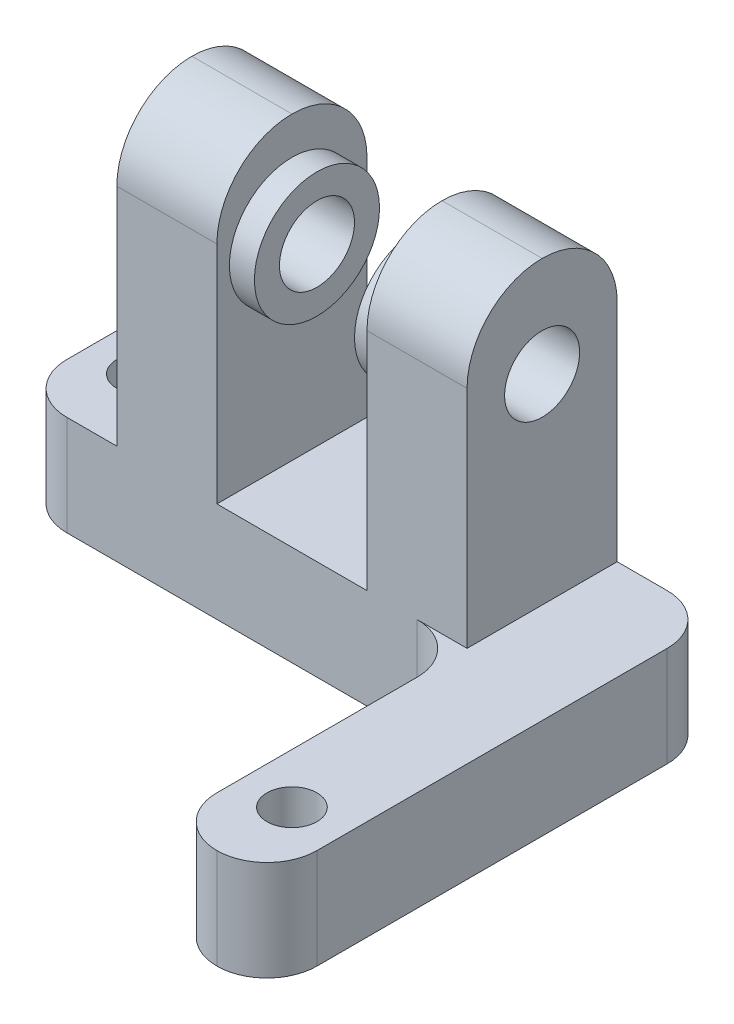
ISO-10303-21;
HEADER;
FILE_DESCRIPTION(('STEP AP214'),'2;1');
FILE_NAME('part.step','',(''),(''),'','','');
FILE_SCHEMA(('AUTOMOTIVE_DESIGN { 1 0 10303 214 1 1 1 1 }'));
ENDSEC;
DATA;
#1=APPLICATION_CONTEXT('core data for automotive mechanical design processes');
#2=APPLICATION_PROTOCOL_DEFINITION('international standard','automotive_design',2000,#1);
#3=PRODUCT_CONTEXT('',#1,'mechanical');
#4=PRODUCT('Part','Part','',(#3));
#5=PRODUCT_RELATED_PRODUCT_CATEGORY('part','',(#4));
#6=PRODUCT_DEFINITION_FORMATION('','',#4);
#7=PRODUCT_DEFINITION_CONTEXT('part definition',#1,'design');
#8=PRODUCT_DEFINITION('design','',#6,#7);
#9=PRODUCT_DEFINITION_SHAPE('','',#8);
#10=(LENGTH_UNIT() NAMED_UNIT(*) SI_UNIT(.MILLI.,.METRE.));
#11=(NAMED_UNIT(*) PLANE_ANGLE_UNIT() SI_UNIT($,.RADIAN.));
#12=(NAMED_UNIT(*) SI_UNIT($,.STERADIAN.) SOLID_ANGLE_UNIT());
#13=UNCERTAINTY_MEASURE_WITH_UNIT(LENGTH_MEASURE(1.E-05),#10,'distance_accuracy_value','');
#14=(GEOMETRIC_REPRESENTATION_CONTEXT(3) GLOBAL_UNCERTAINTY_ASSIGNED_CONTEXT((#13)) GLOBAL_UNIT_ASSIGNED_CONTEXT((#10,
#11,#12)) REPRESENTATION_CONTEXT('',''));
#15=CARTESIAN_POINT('',(0.,0.,0.));
#16=DIRECTION('',(0.,0.,1.));
#17=DIRECTION('',(1.,0.,0.));
#18=AXIS2_PLACEMENT_3D('',#15,#16,#17);
#19=CARTESIAN_POINT('',(-7.,4.,-3.));
#20=DIRECTION('',(1.,0.,0.));
#21=DIRECTION('',(0.,0.,-1.));
#22=AXIS2_PLACEMENT_3D('',#19,#20,#21);
#23=PLANE('',#22);
#24=CARTESIAN_POINT('',(-7.,12.,0.));
#25=DIRECTION('',(1.,0.,0.));
#26=DIRECTION('',(0.,0.,-1.));
#27=AXIS2_PLACEMENT_3D('',#24,#25,#26);
#28=CIRCLE('',#27,1.5);
#29=CARTESIAN_POINT('',(-7.,12.,-1.5));
#30=VERTEX_POINT('',#29);
#31=EDGE_CURVE('E254',#30,#30,#28,.T.);
#32=ORIENTED_EDGE('',*,*,#31,.T.);
#33=EDGE_LOOP('',(#32));
#34=FACE_BOUND('',#33,.T.);
#35=CARTESIAN_POINT('',(-7.,13.,0.));
#36=DIRECTION('',(1.,0.,0.));
#37=DIRECTION('',(0.,0.,-1.));
#38=AXIS2_PLACEMENT_3D('',#35,#36,#37);
#39=CIRCLE('',#38,3.);
#40=CARTESIAN_POINT('',(-7.,13.,3.));
#41=VERTEX_POINT('',#40);
#42=CARTESIAN_POINT('',(-7.,16.,0.));
#43=VERTEX_POINT('',#42);
#44=EDGE_CURVE('E346',#41,#43,#39,.F.);
#45=ORIENTED_EDGE('',*,*,#44,.T.);
#46=CARTESIAN_POINT('',(-7.,13.,0.));
#47=DIRECTION('',(1.,0.,0.));
#48=DIRECTION('',(0.,0.,-1.));
#49=AXIS2_PLACEMENT_3D('',#46,#47,#48);
#50=CIRCLE('',#49,3.);
#51=CARTESIAN_POINT('',(-7.,13.,-3.));
#52=VERTEX_POINT('',#51);
#53=EDGE_CURVE('E184',#43,#52,#50,.F.);
#54=ORIENTED_EDGE('',*,*,#53,.T.);
#55=DIRECTION('',(0.,-1.,0.));
#56=VECTOR('',#55,1.);
#57=CARTESIAN_POINT('',(-7.,4.,-3.));
#58=LINE('',#57,#56);
#59=CARTESIAN_POINT('',(-7.,4.,-3.));
#60=VERTEX_POINT('',#59);
#61=EDGE_CURVE('E178',#52,#60,#58,.T.);
#62=ORIENTED_EDGE('',*,*,#61,.T.);
#63=DIRECTION('',(0.,0.,-1.));
#64=VECTOR('',#63,1.);
#65=CARTESIAN_POINT('',(-7.,4.,3.));
#66=LINE('',#65,#64);
#67=CARTESIAN_POINT('',(-7.,4.,3.));
#68=VERTEX_POINT('',#67);
#69=EDGE_CURVE('E182',#68,#60,#66,.T.);
#70=ORIENTED_EDGE('',*,*,#69,.F.);
#71=DIRECTION('',(0.,-1.,0.));
#72=VECTOR('',#71,1.);
#73=CARTESIAN_POINT('',(-7.,4.,3.));
#74=LINE('',#73,#72);
#75=EDGE_CURVE('E189',#41,#68,#74,.T.);
#76=ORIENTED_EDGE('',*,*,#75,.F.);
#77=EDGE_LOOP('',(#45,#54,#62,#70,#76));
#78=FACE_BOUND('',#77,.T.);
#79=ADVANCED_FACE('F36',(#34,#78),#23,.F.);
#80=CARTESIAN_POINT('',(7.,4.,-3.));
#81=DIRECTION('',(-1.,0.,0.));
#82=DIRECTION('',(0.,0.,1.));
#83=AXIS2_PLACEMENT_3D('',#80,#81,#82);
#84=PLANE('',#83);
#85=CARTESIAN_POINT('',(7.,12.,0.));
#86=DIRECTION('',(-1.,0.,0.));
#87=DIRECTION('',(0.,0.,1.));
#88=AXIS2_PLACEMENT_3D('',#85,#86,#87);
#89=CIRCLE('',#88,1.5);
#90=CARTESIAN_POINT('',(7.,12.,1.5));
#91=VERTEX_POINT('',#90);
#92=EDGE_CURVE('E257',#91,#91,#89,.T.);
#93=ORIENTED_EDGE('',*,*,#92,.T.);
#94=EDGE_LOOP('',(#93));
#95=FACE_BOUND('',#94,.T.);
#96=DIRECTION('',(0.,-1.,0.));
#97=VECTOR('',#96,1.);
#98=CARTESIAN_POINT('',(7.,4.,-3.));
#99=LINE('',#98,#97);
#100=CARTESIAN_POINT('',(7.,13.,-3.));
#101=VERTEX_POINT('',#100);
#102=CARTESIAN_POINT('',(7.,4.,-3.));
#103=VERTEX_POINT('',#102);
#104=EDGE_CURVE('E188',#101,#103,#99,.T.);
#105=ORIENTED_EDGE('',*,*,#104,.F.);
#106=CARTESIAN_POINT('',(7.,13.,0.));
#107=DIRECTION('',(-1.,0.,0.));
#108=DIRECTION('',(0.,0.,1.));
#109=AXIS2_PLACEMENT_3D('',#106,#107,#108);
#110=CIRCLE('',#109,3.);
#111=CARTESIAN_POINT('',(7.,16.,0.));
#112=VERTEX_POINT('',#111);
#113=EDGE_CURVE('E58',#101,#112,#110,.F.);
#114=ORIENTED_EDGE('',*,*,#113,.T.);
#115=CARTESIAN_POINT('',(7.,13.,0.));
#116=DIRECTION('',(-1.,0.,0.));
#117=DIRECTION('',(0.,0.,1.));
#118=AXIS2_PLACEMENT_3D('',#115,#116,#117);
#119=CIRCLE('',#118,3.);
#120=CARTESIAN_POINT('',(7.,13.,3.));
#121=VERTEX_POINT('',#120);
#122=EDGE_CURVE('E53',#112,#121,#119,.F.);
#123=ORIENTED_EDGE('',*,*,#122,.T.);
#124=DIRECTION('',(0.,-1.,0.));
#125=VECTOR('',#124,1.);
#126=CARTESIAN_POINT('',(7.,4.,3.));
#127=LINE('',#126,#125);
#128=CARTESIAN_POINT('',(7.,4.,3.));
#129=VERTEX_POINT('',#128);
#130=EDGE_CURVE('E282',#121,#129,#127,.T.);
#131=ORIENTED_EDGE('',*,*,#130,.T.);
#132=DIRECTION('',(0.,0.,1.));
#133=VECTOR('',#132,1.);
#134=CARTESIAN_POINT('',(7.,4.,-3.));
#135=LINE('',#134,#133);
#136=EDGE_CURVE('E231',#103,#129,#135,.T.);
#137=ORIENTED_EDGE('',*,*,#136,.F.);
#138=EDGE_LOOP('',(#105,#114,#123,#131,#137));
#139=FACE_BOUND('',#138,.T.);
#140=ADVANCED_FACE('F453',(#95,#139),#84,.F.);
#141=CARTESIAN_POINT('',(3.,16.,3.));
#142=DIRECTION('',(1.,0.,0.));
#143=DIRECTION('',(0.,0.,-1.));
#144=AXIS2_PLACEMENT_3D('',#141,#142,#143);
#145=PLANE('',#144);
#146=CARTESIAN_POINT('',(3.,13.,0.));
#147=DIRECTION('',(1.,0.,0.));
#148=DIRECTION('',(0.,0.,-1.));
#149=AXIS2_PLACEMENT_3D('',#146,#147,#148);
#150=CIRCLE('',#149,3.);
#151=CARTESIAN_POINT('',(3.,13.,3.));
#152=VERTEX_POINT('',#151);
#153=CARTESIAN_POINT('',(3.,16.,0.));
#154=VERTEX_POINT('',#153);
#155=EDGE_CURVE('E361',#152,#154,#150,.F.);
#156=ORIENTED_EDGE('',*,*,#155,.T.);
#157=CARTESIAN_POINT('',(3.,13.,0.));
#158=DIRECTION('',(1.,0.,0.));
#159=DIRECTION('',(0.,0.,-1.));
#160=AXIS2_PLACEMENT_3D('',#157,#158,#159);
#161=CIRCLE('',#160,3.);
#162=CARTESIAN_POINT('',(3.,13.,-3.));
#163=VERTEX_POINT('',#162);
#164=EDGE_CURVE('E363',#154,#163,#161,.F.);
#165=ORIENTED_EDGE('',*,*,#164,.T.);
#166=DIRECTION('',(0.,-1.,0.));
#167=VECTOR('',#166,1.);
#168=CARTESIAN_POINT('',(3.,16.,-3.));
#169=LINE('',#168,#167);
#170=CARTESIAN_POINT('',(3.,4.,-3.));
#171=VERTEX_POINT('',#170);
#172=EDGE_CURVE('E260',#163,#171,#169,.T.);
#173=ORIENTED_EDGE('',*,*,#172,.T.);
#174=DIRECTION('',(0.,0.,1.));
#175=VECTOR('',#174,1.);
#176=CARTESIAN_POINT('',(3.,4.,3.));
#177=LINE('',#176,#175);
#178=CARTESIAN_POINT('',(3.,4.,3.));
#179=VERTEX_POINT('',#178);
#180=EDGE_CURVE('E264',#171,#179,#177,.T.);
#181=ORIENTED_EDGE('',*,*,#180,.T.);
#182=DIRECTION('',(0.,-1.,0.));
#183=VECTOR('',#182,1.);
#184=CARTESIAN_POINT('',(3.,16.,3.));
#185=LINE('',#184,#183);
#186=EDGE_CURVE('E262',#152,#179,#185,.T.);
#187=ORIENTED_EDGE('',*,*,#186,.F.);
#188=EDGE_LOOP('',(#156,#165,#173,#181,#187));
#189=FACE_BOUND('',#188,.T.);
#190=CARTESIAN_POINT('',(3.,12.,0.));
#191=DIRECTION('',(1.,0.,0.));
#192=DIRECTION('',(0.,0.,-1.));
#193=AXIS2_PLACEMENT_3D('',#190,#191,#192);
#194=CIRCLE('',#193,2.5);
#195=CARTESIAN_POINT('',(3.,12.,-2.5));
#196=VERTEX_POINT('',#195);
#197=EDGE_CURVE('E292',#196,#196,#194,.F.);
#198=ORIENTED_EDGE('',*,*,#197,.F.);
#199=EDGE_LOOP('',(#198));
#200=FACE_BOUND('',#199,.T.);
#201=ADVANCED_FACE('F384',(#189,#200),#145,.F.);
#202=CARTESIAN_POINT('',(-3.,16.,3.));
#203=DIRECTION('',(-1.,0.,0.));
#204=DIRECTION('',(0.,0.,1.));
#205=AXIS2_PLACEMENT_3D('',#202,#203,#204);
#206=PLANE('',#205);
#207=DIRECTION('',(0.,-1.,0.));
#208=VECTOR('',#207,1.);
#209=CARTESIAN_POINT('',(-3.,16.,-3.));
#210=LINE('',#209,#208);
#211=CARTESIAN_POINT('',(-3.,13.,-3.));
#212=VERTEX_POINT('',#211);
#213=CARTESIAN_POINT('',(-3.,4.,-3.));
#214=VERTEX_POINT('',#213);
#215=EDGE_CURVE('E270',#212,#214,#210,.T.);
#216=ORIENTED_EDGE('',*,*,#215,.F.);
#217=CARTESIAN_POINT('',(-3.,13.,0.));
#218=DIRECTION('',(-1.,0.,0.));
#219=DIRECTION('',(0.,0.,1.));
#220=AXIS2_PLACEMENT_3D('',#217,#218,#219);
#221=CIRCLE('',#220,3.);
#222=CARTESIAN_POINT('',(-3.,16.,0.));
#223=VERTEX_POINT('',#222);
#224=EDGE_CURVE('E359',#212,#223,#221,.F.);
#225=ORIENTED_EDGE('',*,*,#224,.T.);
#226=CARTESIAN_POINT('',(-3.,13.,0.));
#227=DIRECTION('',(-1.,0.,0.));
#228=DIRECTION('',(0.,0.,1.));
#229=AXIS2_PLACEMENT_3D('',#226,#227,#228);
#230=CIRCLE('',#229,3.);
#231=CARTESIAN_POINT('',(-3.,13.,3.));
#232=VERTEX_POINT('',#231);
#233=EDGE_CURVE('E357',#223,#232,#230,.F.);
#234=ORIENTED_EDGE('',*,*,#233,.T.);
#235=DIRECTION('',(0.,-1.,0.));
#236=VECTOR('',#235,1.);
#237=CARTESIAN_POINT('',(-3.,16.,3.));
#238=LINE('',#237,#236);
#239=CARTESIAN_POINT('',(-3.,4.,3.));
#240=VERTEX_POINT('',#239);
#241=EDGE_CURVE('E272',#232,#240,#238,.T.);
#242=ORIENTED_EDGE('',*,*,#241,.T.);
#243=DIRECTION('',(0.,0.,-1.));
#244=VECTOR('',#243,1.);
#245=CARTESIAN_POINT('',(-3.,4.,3.));
#246=LINE('',#245,#244);
#247=EDGE_CURVE('E267',#240,#214,#246,.T.);
#248=ORIENTED_EDGE('',*,*,#247,.T.);
#249=EDGE_LOOP('',(#216,#225,#234,#242,#248));
#250=FACE_BOUND('',#249,.T.);
#251=CARTESIAN_POINT('',(-3.,12.,0.));
#252=DIRECTION('',(-1.,0.,0.));
#253=DIRECTION('',(0.,0.,1.));
#254=AXIS2_PLACEMENT_3D('',#251,#252,#253);
#255=CIRCLE('',#254,2.5);
#256=CARTESIAN_POINT('',(-3.,12.,2.5));
#257=VERTEX_POINT('',#256);
#258=EDGE_CURVE('E289',#257,#257,#255,.F.);
#259=ORIENTED_EDGE('',*,*,#258,.F.);
#260=EDGE_LOOP('',(#259));
#261=FACE_BOUND('',#260,.T.);
#262=ADVANCED_FACE('F394',(#250,#261),#206,.F.);
#263=CARTESIAN_POINT('',(0.,4.,0.));
#264=DIRECTION('',(0.,1.,0.));
#265=DIRECTION('',(0.,0.,1.));
#266=AXIS2_PLACEMENT_3D('',#263,#264,#265);
#267=PLANE('',#266);
#268=DIRECTION('',(1.,0.,0.));
#269=VECTOR('',#268,1.);
#270=CARTESIAN_POINT('',(-7.,4.,3.));
#271=LINE('',#270,#269);
#272=EDGE_CURVE('E278',#240,#179,#271,.T.);
#273=ORIENTED_EDGE('',*,*,#272,.T.);
#274=ORIENTED_EDGE('',*,*,#180,.F.);
#275=DIRECTION('',(-1.,0.,0.));
#276=VECTOR('',#275,1.);
#277=CARTESIAN_POINT('',(-7.,4.,-3.));
#278=LINE('',#277,#276);
#279=EDGE_CURVE('E275',#171,#214,#278,.T.);
#280=ORIENTED_EDGE('',*,*,#279,.T.);
#281=ORIENTED_EDGE('',*,*,#247,.F.);
#282=EDGE_LOOP('',(#273,#274,#280,#281));
#283=FACE_BOUND('',#282,.T.);
#284=ADVANCED_FACE('F390',(#283),#267,.T.);
#285=CARTESIAN_POINT('',(-7.,4.,-3.));
#286=DIRECTION('',(0.,0.,1.));
#287=DIRECTION('',(1.,0.,0.));
#288=AXIS2_PLACEMENT_3D('',#285,#286,#287);
#289=PLANE('',#288);
#290=ORIENTED_EDGE('',*,*,#61,.F.);
#291=DIRECTION('',(-1.,0.,0.));
#292=VECTOR('',#291,1.);
#293=CARTESIAN_POINT('',(-3.,13.,-3.));
#294=LINE('',#293,#292);
#295=EDGE_CURVE('E355',#52,#212,#294,.F.);
#296=ORIENTED_EDGE('',*,*,#295,.T.);
#297=ORIENTED_EDGE('',*,*,#215,.T.);
#298=ORIENTED_EDGE('',*,*,#279,.F.);
#299=ORIENTED_EDGE('',*,*,#172,.F.);
#300=DIRECTION('',(-1.,0.,0.));
#301=VECTOR('',#300,1.);
#302=CARTESIAN_POINT('',(-7.,13.,-3.));
#303=LINE('',#302,#301);
#304=EDGE_CURVE('E352',#163,#101,#303,.F.);
#305=ORIENTED_EDGE('',*,*,#304,.T.);
#306=ORIENTED_EDGE('',*,*,#104,.T.);
#307=DIRECTION('',(-1.,0.,0.));
#308=VECTOR('',#307,1.);
#309=CARTESIAN_POINT('',(11.,4.,-3.));
#310=LINE('',#309,#308);
#311=CARTESIAN_POINT('',(9.,4.,-3.));
#312=VERTEX_POINT('',#311);
#313=EDGE_CURVE('E237',#312,#103,#310,.T.);
#314=ORIENTED_EDGE('',*,*,#313,.F.);
#315=DIRECTION('',(0.,1.,0.));
#316=VECTOR('',#315,1.);
#317=CARTESIAN_POINT('',(9.,0.,-3.));
#318=LINE('',#317,#316);
#319=CARTESIAN_POINT('',(8.99999999999999,0.,-3.));
#320=VERTEX_POINT('',#319);
#321=EDGE_CURVE('E340',#312,#320,#318,.F.);
#322=ORIENTED_EDGE('',*,*,#321,.T.);
#323=DIRECTION('',(-1.,0.,0.));
#324=VECTOR('',#323,1.);
#325=CARTESIAN_POINT('',(-7.,0.,-3.));
#326=LINE('',#325,#324);
#327=CARTESIAN_POINT('',(-9.,0.,-3.));
#328=VERTEX_POINT('',#327);
#329=EDGE_CURVE('E274',#320,#328,#326,.T.);
#330=ORIENTED_EDGE('',*,*,#329,.T.);
#331=DIRECTION('',(0.,1.,0.));
#332=VECTOR('',#331,1.);
#333=CARTESIAN_POINT('',(-9.,4.,-3.));
#334=LINE('',#333,#332);
#335=CARTESIAN_POINT('',(-9.,4.,-3.));
#336=VERTEX_POINT('',#335);
#337=EDGE_CURVE('E197',#328,#336,#334,.T.);
#338=ORIENTED_EDGE('',*,*,#337,.T.);
#339=DIRECTION('',(-1.,0.,0.));
#340=VECTOR('',#339,1.);
#341=CARTESIAN_POINT('',(-7.,4.,-3.));
#342=LINE('',#341,#340);
#343=EDGE_CURVE('E193',#60,#336,#342,.T.);
#344=ORIENTED_EDGE('',*,*,#343,.F.);
#345=EDGE_LOOP('',(#290,#296,#297,#298,#299,#305,#306,#314,#322,#330,#338,#344));
#346=FACE_BOUND('',#345,.T.);
#347=ADVANCED_FACE('F194',(#346),#289,.F.);
#348=CARTESIAN_POINT('',(-7.,4.,3.));
#349=DIRECTION('',(0.,0.,-1.));
#350=DIRECTION('',(-1.,0.,0.));
#351=AXIS2_PLACEMENT_3D('',#348,#349,#350);
#352=PLANE('',#351);
#353=ORIENTED_EDGE('',*,*,#130,.F.);
#354=DIRECTION('',(1.,0.,0.));
#355=VECTOR('',#354,1.);
#356=CARTESIAN_POINT('',(-7.,13.,3.));
#357=LINE('',#356,#355);
#358=EDGE_CURVE('E11',#121,#152,#357,.F.);
#359=ORIENTED_EDGE('',*,*,#358,.T.);
#360=ORIENTED_EDGE('',*,*,#186,.T.);
#361=ORIENTED_EDGE('',*,*,#272,.F.);
#362=ORIENTED_EDGE('',*,*,#241,.F.);
#363=DIRECTION('',(1.,0.,0.));
#364=VECTOR('',#363,1.);
#365=CARTESIAN_POINT('',(-7.,13.,3.));
#366=LINE('',#365,#364);
#367=EDGE_CURVE('E45',#232,#41,#366,.F.);
#368=ORIENTED_EDGE('',*,*,#367,.T.);
#369=ORIENTED_EDGE('',*,*,#75,.T.);
#370=DIRECTION('',(1.,0.,0.));
#371=VECTOR('',#370,1.);
#372=CARTESIAN_POINT('',(-11.,4.,3.));
#373=LINE('',#372,#371);
#374=CARTESIAN_POINT('',(-9.,4.,3.));
#375=VERTEX_POINT('',#374);
#376=EDGE_CURVE('E205',#375,#68,#373,.T.);
#377=ORIENTED_EDGE('',*,*,#376,.F.);
#378=DIRECTION('',(0.,1.,0.));
#379=VECTOR('',#378,1.);
#380=CARTESIAN_POINT('',(-9.,0.,3.));
#381=LINE('',#380,#379);
#382=CARTESIAN_POINT('',(-9.,0.,3.));
#383=VERTEX_POINT('',#382);
#384=EDGE_CURVE('E322',#375,#383,#381,.F.);
#385=ORIENTED_EDGE('',*,*,#384,.T.);
#386=DIRECTION('',(1.,0.,0.));
#387=VECTOR('',#386,1.);
#388=CARTESIAN_POINT('',(-7.,0.,3.));
#389=LINE('',#388,#387);
#390=CARTESIAN_POINT('',(5.,0.,3.));
#391=VERTEX_POINT('',#390);
#392=EDGE_CURVE('E279',#383,#391,#389,.T.);
#393=ORIENTED_EDGE('',*,*,#392,.T.);
#394=DIRECTION('',(0.,-1.,0.));
#395=VECTOR('',#394,1.);
#396=CARTESIAN_POINT('',(5.,4.,3.));
#397=LINE('',#396,#395);
#398=CARTESIAN_POINT('',(5.,4.,3.));
#399=VERTEX_POINT('',#398);
#400=EDGE_CURVE('E327',#391,#399,#397,.F.);
#401=ORIENTED_EDGE('',*,*,#400,.T.);
#402=DIRECTION('',(1.,0.,0.));
#403=VECTOR('',#402,1.);
#404=CARTESIAN_POINT('',(-7.,4.,3.));
#405=LINE('',#404,#403);
#406=EDGE_CURVE('E324',#399,#129,#405,.T.);
#407=ORIENTED_EDGE('',*,*,#406,.T.);
#408=EDGE_LOOP('',(#353,#359,#360,#361,#362,#368,#369,#377,#385,#393,#401,#407));
#409=FACE_BOUND('',#408,.T.);
#410=ADVANCED_FACE('F381',(#409),#352,.F.);
#411=CARTESIAN_POINT('',(0.,0.,0.));
#412=DIRECTION('',(0.,1.,0.));
#413=DIRECTION('',(0.,0.,1.));
#414=AXIS2_PLACEMENT_3D('',#411,#412,#413);
#415=PLANE('',#414);
#416=DIRECTION('',(0.,0.,-1.));
#417=VECTOR('',#416,1.);
#418=CARTESIAN_POINT('',(11.,0.,11.));
#419=LINE('',#418,#417);
#420=CARTESIAN_POINT('',(11.,0.,13.));
#421=VERTEX_POINT('',#420);
#422=CARTESIAN_POINT('',(11.,0.,-1.));
#423=VERTEX_POINT('',#422);
#424=EDGE_CURVE('E230',#421,#423,#419,.T.);
#425=ORIENTED_EDGE('',*,*,#424,.F.);
#426=CARTESIAN_POINT('',(9.,0.,13.));
#427=DIRECTION('',(0.,1.,0.));
#428=DIRECTION('',(0.,0.,1.));
#429=AXIS2_PLACEMENT_3D('',#426,#427,#428);
#430=CIRCLE('',#429,2.);
#431=CARTESIAN_POINT('',(9.00000000000001,0.,15.));
#432=VERTEX_POINT('',#431);
#433=EDGE_CURVE('E315',#421,#432,#430,.F.);
#434=ORIENTED_EDGE('',*,*,#433,.T.);
#435=CARTESIAN_POINT('',(9.00000000000001,0.,13.));
#436=DIRECTION('',(0.,1.,0.));
#437=DIRECTION('',(0.,0.,1.));
#438=AXIS2_PLACEMENT_3D('',#435,#436,#437);
#439=CIRCLE('',#438,2.);
#440=CARTESIAN_POINT('',(7.,0.,13.));
#441=VERTEX_POINT('',#440);
#442=EDGE_CURVE('E313',#432,#441,#439,.F.);
#443=ORIENTED_EDGE('',*,*,#442,.T.);
#444=DIRECTION('',(0.,0.,1.));
#445=VECTOR('',#444,1.);
#446=CARTESIAN_POINT('',(7.,0.,11.));
#447=LINE('',#446,#445);
#448=CARTESIAN_POINT('',(7.,0.,5.));
#449=VERTEX_POINT('',#448);
#450=EDGE_CURVE('E227',#449,#441,#447,.T.);
#451=ORIENTED_EDGE('',*,*,#450,.F.);
#452=CARTESIAN_POINT('',(5.,0.,5.));
#453=DIRECTION('',(0.,1.,0.));
#454=DIRECTION('',(0.,0.,1.));
#455=AXIS2_PLACEMENT_3D('',#452,#453,#454);
#456=CIRCLE('',#455,2.);
#457=EDGE_CURVE('E342',#449,#391,#456,.T.);
#458=ORIENTED_EDGE('',*,*,#457,.T.);
#459=ORIENTED_EDGE('',*,*,#392,.F.);
#460=CARTESIAN_POINT('',(-9.,0.,1.));
#461=DIRECTION('',(0.,1.,0.));
#462=DIRECTION('',(0.,0.,1.));
#463=AXIS2_PLACEMENT_3D('',#460,#461,#462);
#464=CIRCLE('',#463,2.);
#465=CARTESIAN_POINT('',(-11.,0.,1.));
#466=VERTEX_POINT('',#465);
#467=EDGE_CURVE('E311',#383,#466,#464,.F.);
#468=ORIENTED_EDGE('',*,*,#467,.T.);
#469=DIRECTION('',(0.,0.,1.));
#470=VECTOR('',#469,1.);
#471=CARTESIAN_POINT('',(-11.,0.,-3.));
#472=LINE('',#471,#470);
#473=CARTESIAN_POINT('',(-11.,0.,-1.));
#474=VERTEX_POINT('',#473);
#475=EDGE_CURVE('E211',#474,#466,#472,.T.);
#476=ORIENTED_EDGE('',*,*,#475,.F.);
#477=CARTESIAN_POINT('',(-9.,0.,-1.));
#478=DIRECTION('',(0.,1.,0.));
#479=DIRECTION('',(0.,0.,1.));
#480=AXIS2_PLACEMENT_3D('',#477,#478,#479);
#481=CIRCLE('',#480,2.);
#482=EDGE_CURVE('E307',#474,#328,#481,.F.);
#483=ORIENTED_EDGE('',*,*,#482,.T.);
#484=ORIENTED_EDGE('',*,*,#329,.F.);
#485=CARTESIAN_POINT('',(9.,0.,-1.));
#486=DIRECTION('',(0.,1.,0.));
#487=DIRECTION('',(0.,0.,1.));
#488=AXIS2_PLACEMENT_3D('',#485,#486,#487);
#489=CIRCLE('',#488,2.);
#490=EDGE_CURVE('E309',#320,#423,#489,.F.);
#491=ORIENTED_EDGE('',*,*,#490,.T.);
#492=EDGE_LOOP('',(#425,#434,#443,#451,#458,#459,#468,#476,#483,#484,#491));
#493=FACE_BOUND('',#492,.T.);
#494=CARTESIAN_POINT('',(9.,0.,12.));
#495=DIRECTION('',(0.,1.,0.));
#496=DIRECTION('',(0.,0.,1.));
#497=AXIS2_PLACEMENT_3D('',#494,#495,#496);
#498=CIRCLE('',#497,1.);
#499=CARTESIAN_POINT('',(9.,0.,13.));
#500=VERTEX_POINT('',#499);
#501=EDGE_CURVE('E221',#500,#500,#498,.T.);
#502=ORIENTED_EDGE('',*,*,#501,.T.);
#503=EDGE_LOOP('',(#502));
#504=FACE_BOUND('',#503,.T.);
#505=CARTESIAN_POINT('',(-9.,0.,0.));
#506=DIRECTION('',(0.,1.,0.));
#507=DIRECTION('',(0.,0.,1.));
#508=AXIS2_PLACEMENT_3D('',#505,#506,#507);
#509=CIRCLE('',#508,1.);
#510=CARTESIAN_POINT('',(-9.,0.,1.));
#511=VERTEX_POINT('',#510);
#512=EDGE_CURVE('E207',#511,#511,#509,.T.);
#513=ORIENTED_EDGE('',*,*,#512,.T.);
#514=EDGE_LOOP('',(#513));
#515=FACE_BOUND('',#514,.T.);
#516=ADVANCED_FACE('F411',(#493,#504,#515),#415,.F.);
#517=CARTESIAN_POINT('',(-7.,12.,0.));
#518=DIRECTION('',(1.,0.,0.));
#519=DIRECTION('',(0.,0.,-1.));
#520=AXIS2_PLACEMENT_3D('',#517,#518,#519);
#521=CYLINDRICAL_SURFACE('',#520,1.5);
#522=ORIENTED_EDGE('',*,*,#92,.F.);
#523=EDGE_LOOP('',(#522));
#524=FACE_BOUND('',#523,.T.);
#525=CARTESIAN_POINT('',(2.,12.,0.));
#526=DIRECTION('',(-1.,0.,0.));
#527=DIRECTION('',(0.,0.,1.));
#528=AXIS2_PLACEMENT_3D('',#525,#526,#527);
#529=CIRCLE('',#528,1.5);
#530=CARTESIAN_POINT('',(2.,12.,1.5));
#531=VERTEX_POINT('',#530);
#532=EDGE_CURVE('E234',#531,#531,#529,.T.);
#533=ORIENTED_EDGE('',*,*,#532,.T.);
#534=EDGE_LOOP('',(#533));
#535=FACE_BOUND('',#534,.T.);
#536=ADVANCED_FACE('F611',(#524,#535),#521,.F.);
#537=ORIENTED_EDGE('',*,*,#31,.F.);
#538=EDGE_LOOP('',(#537));
#539=FACE_BOUND('',#538,.T.);
#540=CARTESIAN_POINT('',(-2.,12.,0.));
#541=DIRECTION('',(1.,0.,0.));
#542=DIRECTION('',(0.,0.,-1.));
#543=AXIS2_PLACEMENT_3D('',#540,#541,#542);
#544=CIRCLE('',#543,1.5);
#545=CARTESIAN_POINT('',(-2.,12.,-1.5));
#546=VERTEX_POINT('',#545);
#547=EDGE_CURVE('E248',#546,#546,#544,.T.);
#548=ORIENTED_EDGE('',*,*,#547,.T.);
#549=EDGE_LOOP('',(#548));
#550=FACE_BOUND('',#549,.T.);
#551=ADVANCED_FACE('F603',(#539,#550),#521,.F.);
#552=CARTESIAN_POINT('',(-2.,12.,0.));
#553=DIRECTION('',(1.,0.,0.));
#554=DIRECTION('',(0.,0.,-1.));
#555=AXIS2_PLACEMENT_3D('',#552,#553,#554);
#556=PLANE('',#555);
#557=CARTESIAN_POINT('',(-2.,12.,0.));
#558=DIRECTION('',(1.,0.,0.));
#559=DIRECTION('',(0.,0.,-1.));
#560=AXIS2_PLACEMENT_3D('',#557,#558,#559);
#561=CIRCLE('',#560,2.5);
#562=CARTESIAN_POINT('',(-2.,12.,-2.5));
#563=VERTEX_POINT('',#562);
#564=EDGE_CURVE('E251',#563,#563,#561,.T.);
#565=ORIENTED_EDGE('',*,*,#564,.T.);
#566=EDGE_LOOP('',(#565));
#567=FACE_BOUND('',#566,.T.);
#568=ORIENTED_EDGE('',*,*,#547,.F.);
#569=EDGE_LOOP('',(#568));
#570=FACE_BOUND('',#569,.T.);
#571=ADVANCED_FACE('F595',(#567,#570),#556,.T.);
#572=CARTESIAN_POINT('',(-2.,12.,0.));
#573=DIRECTION('',(-1.,0.,0.));
#574=DIRECTION('',(0.,0.,1.));
#575=AXIS2_PLACEMENT_3D('',#572,#573,#574);
#576=CYLINDRICAL_SURFACE('',#575,2.5);
#577=ORIENTED_EDGE('',*,*,#564,.F.);
#578=EDGE_LOOP('',(#577));
#579=FACE_BOUND('',#578,.T.);
#580=ORIENTED_EDGE('',*,*,#258,.T.);
#581=EDGE_LOOP('',(#580));
#582=FACE_BOUND('',#581,.T.);
#583=ADVANCED_FACE('F586',(#579,#582),#576,.T.);
#584=CARTESIAN_POINT('',(2.,12.,0.));
#585=DIRECTION('',(-1.,0.,0.));
#586=DIRECTION('',(0.,0.,1.));
#587=AXIS2_PLACEMENT_3D('',#584,#585,#586);
#588=PLANE('',#587);
#589=CARTESIAN_POINT('',(2.,12.,0.));
#590=DIRECTION('',(-1.,0.,0.));
#591=DIRECTION('',(0.,0.,1.));
#592=AXIS2_PLACEMENT_3D('',#589,#590,#591);
#593=CIRCLE('',#592,2.5);
#594=CARTESIAN_POINT('',(2.,12.,2.5));
#595=VERTEX_POINT('',#594);
#596=EDGE_CURVE('E245',#595,#595,#593,.T.);
#597=ORIENTED_EDGE('',*,*,#596,.T.);
#598=EDGE_LOOP('',(#597));
#599=FACE_BOUND('',#598,.T.);
#600=ORIENTED_EDGE('',*,*,#532,.F.);
#601=EDGE_LOOP('',(#600));
#602=FACE_BOUND('',#601,.T.);
#603=ADVANCED_FACE('F578',(#599,#602),#588,.T.);
#604=CARTESIAN_POINT('',(2.,12.,0.));
#605=DIRECTION('',(1.,0.,0.));
#606=DIRECTION('',(0.,0.,-1.));
#607=AXIS2_PLACEMENT_3D('',#604,#605,#606);
#608=CYLINDRICAL_SURFACE('',#607,2.5);
#609=ORIENTED_EDGE('',*,*,#596,.F.);
#610=EDGE_LOOP('',(#609));
#611=FACE_BOUND('',#610,.T.);
#612=ORIENTED_EDGE('',*,*,#197,.T.);
#613=EDGE_LOOP('',(#612));
#614=FACE_BOUND('',#613,.T.);
#615=ADVANCED_FACE('F572',(#611,#614),#608,.T.);
#616=CARTESIAN_POINT('',(7.,0.,-3.));
#617=DIRECTION('',(-1.,0.,0.));
#618=DIRECTION('',(0.,0.,1.));
#619=AXIS2_PLACEMENT_3D('',#616,#617,#618);
#620=PLANE('',#619);
#621=ORIENTED_EDGE('',*,*,#450,.T.);
#622=DIRECTION('',(0.,1.,0.));
#623=VECTOR('',#622,1.);
#624=CARTESIAN_POINT('',(7.,0.,13.));
#625=LINE('',#624,#623);
#626=CARTESIAN_POINT('',(7.,4.,13.));
#627=VERTEX_POINT('',#626);
#628=EDGE_CURVE('E320',#441,#627,#625,.T.);
#629=ORIENTED_EDGE('',*,*,#628,.T.);
#630=CARTESIAN_POINT('',(7.,4.,5.));
#631=VERTEX_POINT('',#630);
#632=EDGE_CURVE('E240',#631,#627,#135,.T.);
#633=ORIENTED_EDGE('',*,*,#632,.F.);
#634=DIRECTION('',(0.,-1.,0.));
#635=VECTOR('',#634,1.);
#636=CARTESIAN_POINT('',(7.,0.,5.));
#637=LINE('',#636,#635);
#638=EDGE_CURVE('E317',#631,#449,#637,.T.);
#639=ORIENTED_EDGE('',*,*,#638,.T.);
#640=EDGE_LOOP('',(#621,#629,#633,#639));
#641=FACE_BOUND('',#640,.T.);
#642=ADVANCED_FACE('F444',(#641),#620,.T.);
#643=CARTESIAN_POINT('',(11.,0.,-3.));
#644=DIRECTION('',(1.,0.,0.));
#645=DIRECTION('',(0.,0.,-1.));
#646=AXIS2_PLACEMENT_3D('',#643,#644,#645);
#647=PLANE('',#646);
#648=DIRECTION('',(0.,0.,-1.));
#649=VECTOR('',#648,1.);
#650=CARTESIAN_POINT('',(11.,4.,-3.));
#651=LINE('',#650,#649);
#652=CARTESIAN_POINT('',(11.,4.,13.));
#653=VERTEX_POINT('',#652);
#654=CARTESIAN_POINT('',(11.,4.,-1.));
#655=VERTEX_POINT('',#654);
#656=EDGE_CURVE('E224',#653,#655,#651,.T.);
#657=ORIENTED_EDGE('',*,*,#656,.F.);
#658=DIRECTION('',(0.,1.,0.));
#659=VECTOR('',#658,1.);
#660=CARTESIAN_POINT('',(11.,0.,13.));
#661=LINE('',#660,#659);
#662=EDGE_CURVE('E304',#653,#421,#661,.F.);
#663=ORIENTED_EDGE('',*,*,#662,.T.);
#664=ORIENTED_EDGE('',*,*,#424,.T.);
#665=DIRECTION('',(0.,1.,0.));
#666=VECTOR('',#665,1.);
#667=CARTESIAN_POINT('',(11.,4.,-1.));
#668=LINE('',#667,#666);
#669=EDGE_CURVE('E301',#423,#655,#668,.T.);
#670=ORIENTED_EDGE('',*,*,#669,.T.);
#671=EDGE_LOOP('',(#657,#663,#664,#670));
#672=FACE_BOUND('',#671,.T.);
#673=ADVANCED_FACE('F429',(#672),#647,.T.);
#674=CARTESIAN_POINT('',(0.,4.,0.));
#675=DIRECTION('',(0.,1.,0.));
#676=DIRECTION('',(0.,0.,1.));
#677=AXIS2_PLACEMENT_3D('',#674,#675,#676);
#678=PLANE('',#677);
#679=CARTESIAN_POINT('',(9.,4.,12.));
#680=DIRECTION('',(0.,1.,0.));
#681=DIRECTION('',(0.,0.,1.));
#682=AXIS2_PLACEMENT_3D('',#679,#680,#681);
#683=CIRCLE('',#682,1.);
#684=CARTESIAN_POINT('',(9.,4.,13.));
#685=VERTEX_POINT('',#684);
#686=EDGE_CURVE('E218',#685,#685,#683,.T.);
#687=ORIENTED_EDGE('',*,*,#686,.F.);
#688=EDGE_LOOP('',(#687));
#689=FACE_BOUND('',#688,.T.);
#690=CARTESIAN_POINT('',(9.00000000000001,4.,13.));
#691=DIRECTION('',(0.,1.,0.));
#692=DIRECTION('',(0.,0.,1.));
#693=AXIS2_PLACEMENT_3D('',#690,#691,#692);
#694=CIRCLE('',#693,2.);
#695=CARTESIAN_POINT('',(9.00000000000001,4.,15.));
#696=VERTEX_POINT('',#695);
#697=EDGE_CURVE('E297',#627,#696,#694,.T.);
#698=ORIENTED_EDGE('',*,*,#697,.T.);
#699=CARTESIAN_POINT('',(9.,4.,13.));
#700=DIRECTION('',(0.,1.,0.));
#701=DIRECTION('',(0.,0.,1.));
#702=AXIS2_PLACEMENT_3D('',#699,#700,#701);
#703=CIRCLE('',#702,2.);
#704=EDGE_CURVE('E299',#696,#653,#703,.T.);
#705=ORIENTED_EDGE('',*,*,#704,.T.);
#706=ORIENTED_EDGE('',*,*,#656,.T.);
#707=CARTESIAN_POINT('',(9.,4.,-1.));
#708=DIRECTION('',(0.,1.,0.));
#709=DIRECTION('',(0.,0.,1.));
#710=AXIS2_PLACEMENT_3D('',#707,#708,#709);
#711=CIRCLE('',#710,2.);
#712=EDGE_CURVE('E295',#655,#312,#711,.T.);
#713=ORIENTED_EDGE('',*,*,#712,.T.);
#714=ORIENTED_EDGE('',*,*,#313,.T.);
#715=ORIENTED_EDGE('',*,*,#136,.T.);
#716=ORIENTED_EDGE('',*,*,#406,.F.);
#717=CARTESIAN_POINT('',(5.,4.,5.));
#718=DIRECTION('',(0.,1.,0.));
#719=DIRECTION('',(0.,0.,1.));
#720=AXIS2_PLACEMENT_3D('',#717,#718,#719);
#721=CIRCLE('',#720,2.);
#722=EDGE_CURVE('E344',#399,#631,#721,.F.);
#723=ORIENTED_EDGE('',*,*,#722,.T.);
#724=ORIENTED_EDGE('',*,*,#632,.T.);
#725=EDGE_LOOP('',(#698,#705,#706,#713,#714,#715,#716,#723,#724));
#726=FACE_BOUND('',#725,.T.);
#727=ADVANCED_FACE('F447',(#689,#726),#678,.T.);
#728=CARTESIAN_POINT('',(9.,0.,12.));
#729=DIRECTION('',(0.,1.,0.));
#730=DIRECTION('',(0.,0.,1.));
#731=AXIS2_PLACEMENT_3D('',#728,#729,#730);
#732=CYLINDRICAL_SURFACE('',#731,1.);
#733=ORIENTED_EDGE('',*,*,#501,.F.);
#734=EDGE_LOOP('',(#733));
#735=FACE_BOUND('',#734,.T.);
#736=ORIENTED_EDGE('',*,*,#686,.T.);
#737=EDGE_LOOP('',(#736));
#738=FACE_BOUND('',#737,.T.);
#739=ADVANCED_FACE('F545',(#735,#738),#732,.F.);
#740=CARTESIAN_POINT('',(-11.,0.,-3.));
#741=DIRECTION('',(-1.,0.,0.));
#742=DIRECTION('',(0.,0.,1.));
#743=AXIS2_PLACEMENT_3D('',#740,#741,#742);
#744=PLANE('',#743);
#745=ORIENTED_EDGE('',*,*,#475,.T.);
#746=DIRECTION('',(0.,1.,0.));
#747=VECTOR('',#746,1.);
#748=CARTESIAN_POINT('',(-11.,4.,1.));
#749=LINE('',#748,#747);
#750=CARTESIAN_POINT('',(-11.,4.,1.));
#751=VERTEX_POINT('',#750);
#752=EDGE_CURVE('E332',#466,#751,#749,.T.);
#753=ORIENTED_EDGE('',*,*,#752,.T.);
#754=DIRECTION('',(0.,0.,1.));
#755=VECTOR('',#754,1.);
#756=CARTESIAN_POINT('',(-11.,4.,-3.));
#757=LINE('',#756,#755);
#758=CARTESIAN_POINT('',(-11.,4.,-1.));
#759=VERTEX_POINT('',#758);
#760=EDGE_CURVE('E199',#759,#751,#757,.T.);
#761=ORIENTED_EDGE('',*,*,#760,.F.);
#762=DIRECTION('',(0.,1.,0.));
#763=VECTOR('',#762,1.);
#764=CARTESIAN_POINT('',(-11.,0.,-1.));
#765=LINE('',#764,#763);
#766=EDGE_CURVE('E330',#759,#474,#765,.F.);
#767=ORIENTED_EDGE('',*,*,#766,.T.);
#768=EDGE_LOOP('',(#745,#753,#761,#767));
#769=FACE_BOUND('',#768,.T.);
#770=ADVANCED_FACE('F415',(#769),#744,.T.);
#771=CARTESIAN_POINT('',(0.,4.,0.));
#772=DIRECTION('',(0.,1.,0.));
#773=DIRECTION('',(0.,0.,1.));
#774=AXIS2_PLACEMENT_3D('',#771,#772,#773);
#775=PLANE('',#774);
#776=CARTESIAN_POINT('',(-9.,4.,0.));
#777=DIRECTION('',(0.,1.,0.));
#778=DIRECTION('',(0.,0.,1.));
#779=AXIS2_PLACEMENT_3D('',#776,#777,#778);
#780=CIRCLE('',#779,1.);
#781=CARTESIAN_POINT('',(-9.,4.,1.));
#782=VERTEX_POINT('',#781);
#783=EDGE_CURVE('E215',#782,#782,#780,.T.);
#784=ORIENTED_EDGE('',*,*,#783,.F.);
#785=EDGE_LOOP('',(#784));
#786=FACE_BOUND('',#785,.T.);
#787=ORIENTED_EDGE('',*,*,#760,.T.);
#788=CARTESIAN_POINT('',(-9.,4.,1.));
#789=DIRECTION('',(0.,1.,0.));
#790=DIRECTION('',(0.,0.,1.));
#791=AXIS2_PLACEMENT_3D('',#788,#789,#790);
#792=CIRCLE('',#791,2.);
#793=EDGE_CURVE('E337',#751,#375,#792,.T.);
#794=ORIENTED_EDGE('',*,*,#793,.T.);
#795=ORIENTED_EDGE('',*,*,#376,.T.);
#796=ORIENTED_EDGE('',*,*,#69,.T.);
#797=ORIENTED_EDGE('',*,*,#343,.T.);
#798=CARTESIAN_POINT('',(-9.,4.,-1.));
#799=DIRECTION('',(0.,1.,0.));
#800=DIRECTION('',(0.,0.,1.));
#801=AXIS2_PLACEMENT_3D('',#798,#799,#800);
#802=CIRCLE('',#801,2.);
#803=EDGE_CURVE('E335',#336,#759,#802,.T.);
#804=ORIENTED_EDGE('',*,*,#803,.T.);
#805=EDGE_LOOP('',(#787,#794,#795,#796,#797,#804));
#806=FACE_BOUND('',#805,.T.);
#807=ADVANCED_FACE('F203',(#786,#806),#775,.T.);
#808=CARTESIAN_POINT('',(-9.,0.,0.));
#809=DIRECTION('',(0.,1.,0.));
#810=DIRECTION('',(0.,0.,1.));
#811=AXIS2_PLACEMENT_3D('',#808,#809,#810);
#812=CYLINDRICAL_SURFACE('',#811,1.);
#813=ORIENTED_EDGE('',*,*,#512,.F.);
#814=EDGE_LOOP('',(#813));
#815=FACE_BOUND('',#814,.T.);
#816=ORIENTED_EDGE('',*,*,#783,.T.);
#817=EDGE_LOOP('',(#816));
#818=FACE_BOUND('',#817,.T.);
#819=ADVANCED_FACE('F470',(#815,#818),#812,.F.);
#820=CARTESIAN_POINT('',(9.00000000000001,0.,13.));
#821=DIRECTION('',(0.,1.,0.));
#822=DIRECTION('',(0.,0.,1.));
#823=AXIS2_PLACEMENT_3D('',#820,#821,#822);
#824=CYLINDRICAL_SURFACE('',#823,2.);
#825=ORIENTED_EDGE('',*,*,#628,.F.);
#826=ORIENTED_EDGE('',*,*,#442,.F.);
#827=DIRECTION('',(0.,1.,0.));
#828=VECTOR('',#827,1.);
#829=CARTESIAN_POINT('',(9.00000000000001,0.,15.));
#830=LINE('',#829,#828);
#831=EDGE_CURVE('E214',#696,#432,#830,.F.);
#832=ORIENTED_EDGE('',*,*,#831,.F.);
#833=ORIENTED_EDGE('',*,*,#697,.F.);
#834=EDGE_LOOP('',(#825,#826,#832,#833));
#835=FACE_BOUND('',#834,.T.);
#836=ADVANCED_FACE('F439',(#835),#824,.T.);
#837=CARTESIAN_POINT('',(9.,0.,13.));
#838=DIRECTION('',(0.,1.,0.));
#839=DIRECTION('',(0.,0.,1.));
#840=AXIS2_PLACEMENT_3D('',#837,#838,#839);
#841=CYLINDRICAL_SURFACE('',#840,2.);
#842=ORIENTED_EDGE('',*,*,#433,.F.);
#843=ORIENTED_EDGE('',*,*,#662,.F.);
#844=ORIENTED_EDGE('',*,*,#704,.F.);
#845=ORIENTED_EDGE('',*,*,#831,.T.);
#846=EDGE_LOOP('',(#842,#843,#844,#845));
#847=FACE_BOUND('',#846,.T.);
#848=ADVANCED_FACE('F433',(#847),#841,.T.);
#849=CARTESIAN_POINT('',(5.,0.,5.));
#850=DIRECTION('',(0.,-1.,0.));
#851=DIRECTION('',(0.,0.,-1.));
#852=AXIS2_PLACEMENT_3D('',#849,#850,#851);
#853=CYLINDRICAL_SURFACE('',#852,2.);
#854=ORIENTED_EDGE('',*,*,#722,.F.);
#855=ORIENTED_EDGE('',*,*,#400,.F.);
#856=ORIENTED_EDGE('',*,*,#457,.F.);
#857=ORIENTED_EDGE('',*,*,#638,.F.);
#858=EDGE_LOOP('',(#854,#855,#856,#857));
#859=FACE_BOUND('',#858,.T.);
#860=ADVANCED_FACE('F451',(#859),#853,.F.);
#861=CARTESIAN_POINT('',(-9.,0.,1.));
#862=DIRECTION('',(0.,-1.,0.));
#863=DIRECTION('',(0.,0.,-1.));
#864=AXIS2_PLACEMENT_3D('',#861,#862,#863);
#865=CYLINDRICAL_SURFACE('',#864,2.);
#866=ORIENTED_EDGE('',*,*,#467,.F.);
#867=ORIENTED_EDGE('',*,*,#384,.F.);
#868=ORIENTED_EDGE('',*,*,#793,.F.);
#869=ORIENTED_EDGE('',*,*,#752,.F.);
#870=EDGE_LOOP('',(#866,#867,#868,#869));
#871=FACE_BOUND('',#870,.T.);
#872=ADVANCED_FACE('F406',(#871),#865,.T.);
#873=CARTESIAN_POINT('',(9.,0.,-1.));
#874=DIRECTION('',(0.,-1.,0.));
#875=DIRECTION('',(0.,0.,-1.));
#876=AXIS2_PLACEMENT_3D('',#873,#874,#875);
#877=CYLINDRICAL_SURFACE('',#876,2.);
#878=ORIENTED_EDGE('',*,*,#490,.F.);
#879=ORIENTED_EDGE('',*,*,#321,.F.);
#880=ORIENTED_EDGE('',*,*,#712,.F.);
#881=ORIENTED_EDGE('',*,*,#669,.F.);
#882=EDGE_LOOP('',(#878,#879,#880,#881));
#883=FACE_BOUND('',#882,.T.);
#884=ADVANCED_FACE('F425',(#883),#877,.T.);
#885=CARTESIAN_POINT('',(-9.,4.,-1.));
#886=DIRECTION('',(0.,-1.,0.));
#887=DIRECTION('',(0.,0.,-1.));
#888=AXIS2_PLACEMENT_3D('',#885,#886,#887);
#889=CYLINDRICAL_SURFACE('',#888,2.);
#890=ORIENTED_EDGE('',*,*,#482,.F.);
#891=ORIENTED_EDGE('',*,*,#766,.F.);
#892=ORIENTED_EDGE('',*,*,#803,.F.);
#893=ORIENTED_EDGE('',*,*,#337,.F.);
#894=EDGE_LOOP('',(#890,#891,#892,#893));
#895=FACE_BOUND('',#894,.T.);
#896=ADVANCED_FACE('F419',(#895),#889,.T.);
#897=CARTESIAN_POINT('',(0.,13.,0.));
#898=DIRECTION('',(-1.,0.,0.));
#899=DIRECTION('',(0.,0.,1.));
#900=AXIS2_PLACEMENT_3D('',#897,#898,#899);
#901=CYLINDRICAL_SURFACE('',#900,3.);
#902=ORIENTED_EDGE('',*,*,#367,.F.);
#903=ORIENTED_EDGE('',*,*,#233,.F.);
#904=DIRECTION('',(1.,0.,0.));
#905=VECTOR('',#904,1.);
#906=CARTESIAN_POINT('',(-3.,16.,0.));
#907=LINE('',#906,#905);
#908=EDGE_CURVE('E349',#43,#223,#907,.T.);
#909=ORIENTED_EDGE('',*,*,#908,.F.);
#910=ORIENTED_EDGE('',*,*,#44,.F.);
#911=EDGE_LOOP('',(#902,#903,#909,#910));
#912=FACE_BOUND('',#911,.T.);
#913=ADVANCED_FACE('F401',(#912),#901,.T.);
#914=CARTESIAN_POINT('',(0.,13.,0.));
#915=DIRECTION('',(1.,0.,0.));
#916=DIRECTION('',(0.,0.,-1.));
#917=AXIS2_PLACEMENT_3D('',#914,#915,#916);
#918=CYLINDRICAL_SURFACE('',#917,3.);
#919=ORIENTED_EDGE('',*,*,#224,.F.);
#920=ORIENTED_EDGE('',*,*,#295,.F.);
#921=ORIENTED_EDGE('',*,*,#53,.F.);
#922=ORIENTED_EDGE('',*,*,#908,.T.);
#923=EDGE_LOOP('',(#919,#920,#921,#922));
#924=FACE_BOUND('',#923,.T.);
#925=ADVANCED_FACE('F479',(#924),#918,.T.);
#926=CARTESIAN_POINT('',(0.,13.,0.));
#927=DIRECTION('',(1.,0.,0.));
#928=DIRECTION('',(0.,0.,-1.));
#929=AXIS2_PLACEMENT_3D('',#926,#927,#928);
#930=CYLINDRICAL_SURFACE('',#929,3.);
#931=ORIENTED_EDGE('',*,*,#358,.F.);
#932=ORIENTED_EDGE('',*,*,#122,.F.);
#933=DIRECTION('',(1.,0.,0.));
#934=VECTOR('',#933,1.);
#935=CARTESIAN_POINT('',(0.,16.,0.));
#936=LINE('',#935,#934);
#937=EDGE_CURVE('E40',#154,#112,#936,.T.);
#938=ORIENTED_EDGE('',*,*,#937,.F.);
#939=ORIENTED_EDGE('',*,*,#155,.F.);
#940=EDGE_LOOP('',(#931,#932,#938,#939));
#941=FACE_BOUND('',#940,.T.);
#942=ADVANCED_FACE('F38',(#941),#930,.T.);
#943=CARTESIAN_POINT('',(0.,13.,0.));
#944=DIRECTION('',(-1.,0.,0.));
#945=DIRECTION('',(0.,0.,1.));
#946=AXIS2_PLACEMENT_3D('',#943,#944,#945);
#947=CYLINDRICAL_SURFACE('',#946,3.);
#948=ORIENTED_EDGE('',*,*,#113,.F.);
#949=ORIENTED_EDGE('',*,*,#304,.F.);
#950=ORIENTED_EDGE('',*,*,#164,.F.);
#951=ORIENTED_EDGE('',*,*,#937,.T.);
#952=EDGE_LOOP('',(#948,#949,#950,#951));
#953=FACE_BOUND('',#952,.T.);
#954=ADVANCED_FACE('F374',(#953),#947,.T.);
#955=CLOSED_SHELL('',(#79,#140,#201,#262,#284,#347,#410,#516,#536,#551,#571,#583,#603,#615,#642,
#673,#727,#739,#770,#807,#819,#836,#848,#860,#872,#884,#896,#913,#925,#942,#954));
#956=MANIFOLD_SOLID_BREP('B2',#955);
#957=ADVANCED_BREP_SHAPE_REPRESENTATION('',(#18,#956),#14);
#958=SHAPE_DEFINITION_REPRESENTATION(#9,#957);
ENDSEC;
END-ISO-10303-21;
